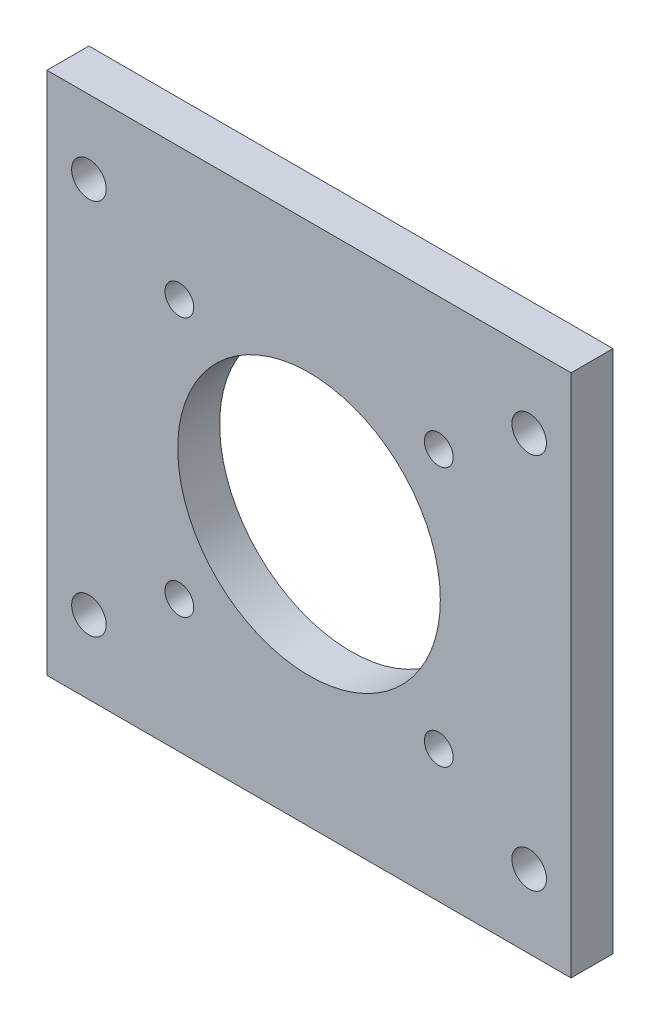
ISO-10303-21;
HEADER;
FILE_DESCRIPTION(('STEP AP214'),'2;1');
FILE_NAME('part.step','',(''),(''),'','','');
FILE_SCHEMA(('AUTOMOTIVE_DESIGN { 1 0 10303 214 1 1 1 1 }'));
ENDSEC;
DATA;
#1=APPLICATION_CONTEXT('core data for automotive mechanical design processes');
#2=APPLICATION_PROTOCOL_DEFINITION('international standard','automotive_design',2000,#1);
#3=PRODUCT_CONTEXT('',#1,'mechanical');
#4=PRODUCT('Part','Part','',(#3));
#5=PRODUCT_RELATED_PRODUCT_CATEGORY('part','',(#4));
#6=PRODUCT_DEFINITION_FORMATION('','',#4);
#7=PRODUCT_DEFINITION_CONTEXT('part definition',#1,'design');
#8=PRODUCT_DEFINITION('design','',#6,#7);
#9=PRODUCT_DEFINITION_SHAPE('','',#8);
#10=(LENGTH_UNIT() NAMED_UNIT(*) SI_UNIT(.MILLI.,.METRE.));
#11=(NAMED_UNIT(*) PLANE_ANGLE_UNIT() SI_UNIT($,.RADIAN.));
#12=(NAMED_UNIT(*) SI_UNIT($,.STERADIAN.) SOLID_ANGLE_UNIT());
#13=UNCERTAINTY_MEASURE_WITH_UNIT(LENGTH_MEASURE(1.E-05),#10,'distance_accuracy_value','');
#14=(GEOMETRIC_REPRESENTATION_CONTEXT(3) GLOBAL_UNCERTAINTY_ASSIGNED_CONTEXT((#13)) GLOBAL_UNIT_ASSIGNED_CONTEXT((#10,
#11,#12)) REPRESENTATION_CONTEXT('',''));
#15=CARTESIAN_POINT('',(0.,0.,0.));
#16=DIRECTION('',(0.,0.,1.));
#17=DIRECTION('',(1.,0.,0.));
#18=AXIS2_PLACEMENT_3D('',#15,#16,#17);
#19=CARTESIAN_POINT('',(0.,0.,8.));
#20=DIRECTION('',(0.,0.,-1.));
#21=DIRECTION('',(-1.,0.,0.));
#22=AXIS2_PLACEMENT_3D('',#19,#20,#21);
#23=PLANE('',#22);
#24=DIRECTION('',(0.,-1.,0.));
#25=VECTOR('',#24,1.);
#26=CARTESIAN_POINT('',(-50.,-50.,8.));
#27=LINE('',#26,#25);
#28=CARTESIAN_POINT('',(-50.,50.,8.));
#29=VERTEX_POINT('',#28);
#30=CARTESIAN_POINT('',(-50.,-50.,8.));
#31=VERTEX_POINT('',#30);
#32=EDGE_CURVE('E91',#29,#31,#27,.T.);
#33=ORIENTED_EDGE('',*,*,#32,.T.);
#34=DIRECTION('',(1.,0.,0.));
#35=VECTOR('',#34,1.);
#36=CARTESIAN_POINT('',(-50.,-50.,8.));
#37=LINE('',#36,#35);
#38=CARTESIAN_POINT('',(50.,-50.,8.));
#39=VERTEX_POINT('',#38);
#40=EDGE_CURVE('E86',#31,#39,#37,.T.);
#41=ORIENTED_EDGE('',*,*,#40,.T.);
#42=DIRECTION('',(0.,1.,0.));
#43=VECTOR('',#42,1.);
#44=CARTESIAN_POINT('',(50.,-50.,8.));
#45=LINE('',#44,#43);
#46=CARTESIAN_POINT('',(50.,50.,8.));
#47=VERTEX_POINT('',#46);
#48=EDGE_CURVE('E87',#39,#47,#45,.T.);
#49=ORIENTED_EDGE('',*,*,#48,.T.);
#50=DIRECTION('',(-1.,0.,0.));
#51=VECTOR('',#50,1.);
#52=CARTESIAN_POINT('',(-50.,50.,8.));
#53=LINE('',#52,#51);
#54=EDGE_CURVE('E57',#47,#29,#53,.T.);
#55=ORIENTED_EDGE('',*,*,#54,.T.);
#56=EDGE_LOOP('',(#33,#41,#49,#55));
#57=FACE_BOUND('',#56,.T.);
#58=CARTESIAN_POINT('',(0.,0.,8.));
#59=DIRECTION('',(0.,0.,1.));
#60=DIRECTION('',(1.,0.,0.));
#61=AXIS2_PLACEMENT_3D('',#58,#59,#60);
#62=CIRCLE('',#61,25.05);
#63=CARTESIAN_POINT('',(25.05,0.,8.));
#64=VERTEX_POINT('',#63);
#65=EDGE_CURVE('E107',#64,#64,#62,.T.);
#66=ORIENTED_EDGE('',*,*,#65,.F.);
#67=EDGE_LOOP('',(#66));
#68=FACE_BOUND('',#67,.T.);
#69=CARTESIAN_POINT('',(-42.,-36.,8.));
#70=DIRECTION('',(0.,0.,1.));
#71=DIRECTION('',(1.,0.,0.));
#72=AXIS2_PLACEMENT_3D('',#69,#70,#71);
#73=CIRCLE('',#72,3.3);
#74=CARTESIAN_POINT('',(-38.7,-36.,8.));
#75=VERTEX_POINT('',#74);
#76=EDGE_CURVE('E123',#75,#75,#73,.T.);
#77=ORIENTED_EDGE('',*,*,#76,.F.);
#78=EDGE_LOOP('',(#77));
#79=FACE_BOUND('',#78,.T.);
#80=CARTESIAN_POINT('',(-42.,36.,8.));
#81=DIRECTION('',(0.,0.,1.));
#82=DIRECTION('',(1.,0.,0.));
#83=AXIS2_PLACEMENT_3D('',#80,#81,#82);
#84=CIRCLE('',#83,3.3);
#85=CARTESIAN_POINT('',(-38.7,36.,8.));
#86=VERTEX_POINT('',#85);
#87=EDGE_CURVE('E130',#86,#86,#84,.T.);
#88=ORIENTED_EDGE('',*,*,#87,.F.);
#89=EDGE_LOOP('',(#88));
#90=FACE_BOUND('',#89,.T.);
#91=CARTESIAN_POINT('',(42.,-36.,8.));
#92=DIRECTION('',(0.,0.,1.));
#93=DIRECTION('',(1.,0.,0.));
#94=AXIS2_PLACEMENT_3D('',#91,#92,#93);
#95=CIRCLE('',#94,3.3);
#96=CARTESIAN_POINT('',(45.3,-36.,8.));
#97=VERTEX_POINT('',#96);
#98=EDGE_CURVE('E133',#97,#97,#95,.T.);
#99=ORIENTED_EDGE('',*,*,#98,.F.);
#100=EDGE_LOOP('',(#99));
#101=FACE_BOUND('',#100,.T.);
#102=CARTESIAN_POINT('',(42.,36.,8.));
#103=DIRECTION('',(0.,0.,1.));
#104=DIRECTION('',(1.,0.,0.));
#105=AXIS2_PLACEMENT_3D('',#102,#103,#104);
#106=CIRCLE('',#105,3.3);
#107=CARTESIAN_POINT('',(45.3,36.,8.));
#108=VERTEX_POINT('',#107);
#109=EDGE_CURVE('E137',#108,#108,#106,.T.);
#110=ORIENTED_EDGE('',*,*,#109,.F.);
#111=EDGE_LOOP('',(#110));
#112=FACE_BOUND('',#111,.T.);
#113=CARTESIAN_POINT('',(-24.7487373415292,-24.7487373415292,8.));
#114=DIRECTION('',(0.,0.,1.));
#115=DIRECTION('',(1.,0.,0.));
#116=AXIS2_PLACEMENT_3D('',#113,#114,#115);
#117=CIRCLE('',#116,2.75);
#118=CARTESIAN_POINT('',(-21.9987373415292,-24.7487373415292,8.));
#119=VERTEX_POINT('',#118);
#120=EDGE_CURVE('E144',#119,#119,#117,.T.);
#121=ORIENTED_EDGE('',*,*,#120,.F.);
#122=EDGE_LOOP('',(#121));
#123=FACE_BOUND('',#122,.T.);
#124=CARTESIAN_POINT('',(-24.7487373415292,24.7487373415292,8.));
#125=DIRECTION('',(0.,0.,1.));
#126=DIRECTION('',(1.,0.,0.));
#127=AXIS2_PLACEMENT_3D('',#124,#125,#126);
#128=CIRCLE('',#127,2.75);
#129=CARTESIAN_POINT('',(-21.9987373415292,24.7487373415292,8.));
#130=VERTEX_POINT('',#129);
#131=EDGE_CURVE('E152',#130,#130,#128,.T.);
#132=ORIENTED_EDGE('',*,*,#131,.F.);
#133=EDGE_LOOP('',(#132));
#134=FACE_BOUND('',#133,.T.);
#135=CARTESIAN_POINT('',(24.7487373415292,-24.7487373415292,8.));
#136=DIRECTION('',(0.,0.,1.));
#137=DIRECTION('',(1.,0.,0.));
#138=AXIS2_PLACEMENT_3D('',#135,#136,#137);
#139=CIRCLE('',#138,2.75);
#140=CARTESIAN_POINT('',(27.4987373415292,-24.7487373415292,8.));
#141=VERTEX_POINT('',#140);
#142=EDGE_CURVE('E160',#141,#141,#139,.T.);
#143=ORIENTED_EDGE('',*,*,#142,.F.);
#144=EDGE_LOOP('',(#143));
#145=FACE_BOUND('',#144,.T.);
#146=CARTESIAN_POINT('',(24.7487373415292,24.7487373415292,8.));
#147=DIRECTION('',(0.,0.,1.));
#148=DIRECTION('',(1.,0.,0.));
#149=AXIS2_PLACEMENT_3D('',#146,#147,#148);
#150=CIRCLE('',#149,2.75);
#151=CARTESIAN_POINT('',(27.4987373415292,24.7487373415292,8.));
#152=VERTEX_POINT('',#151);
#153=EDGE_CURVE('E165',#152,#152,#150,.T.);
#154=ORIENTED_EDGE('',*,*,#153,.F.);
#155=EDGE_LOOP('',(#154));
#156=FACE_BOUND('',#155,.T.);
#157=ADVANCED_FACE('F39',(#57,#68,#79,#90,#101,#112,#123,#134,#145,#156),#23,.F.);
#158=CARTESIAN_POINT('',(0.,0.,0.));
#159=DIRECTION('',(0.,0.,-1.));
#160=DIRECTION('',(-1.,0.,0.));
#161=AXIS2_PLACEMENT_3D('',#158,#159,#160);
#162=PLANE('',#161);
#163=CARTESIAN_POINT('',(24.7487373415292,-24.7487373415292,0.));
#164=DIRECTION('',(0.,0.,1.));
#165=DIRECTION('',(1.,0.,0.));
#166=AXIS2_PLACEMENT_3D('',#163,#164,#165);
#167=CIRCLE('',#166,2.75);
#168=CARTESIAN_POINT('',(27.4987373415292,-24.7487373415292,0.));
#169=VERTEX_POINT('',#168);
#170=EDGE_CURVE('E158',#169,#169,#167,.T.);
#171=ORIENTED_EDGE('',*,*,#170,.T.);
#172=EDGE_LOOP('',(#171));
#173=FACE_BOUND('',#172,.T.);
#174=CARTESIAN_POINT('',(-24.7487373415292,-24.7487373415292,0.));
#175=DIRECTION('',(0.,0.,1.));
#176=DIRECTION('',(1.,0.,0.));
#177=AXIS2_PLACEMENT_3D('',#174,#175,#176);
#178=CIRCLE('',#177,2.75);
#179=CARTESIAN_POINT('',(-21.9987373415292,-24.7487373415292,0.));
#180=VERTEX_POINT('',#179);
#181=EDGE_CURVE('E149',#180,#180,#178,.T.);
#182=ORIENTED_EDGE('',*,*,#181,.T.);
#183=EDGE_LOOP('',(#182));
#184=FACE_BOUND('',#183,.T.);
#185=CARTESIAN_POINT('',(42.,-36.,0.));
#186=DIRECTION('',(0.,0.,1.));
#187=DIRECTION('',(1.,0.,0.));
#188=AXIS2_PLACEMENT_3D('',#185,#186,#187);
#189=CIRCLE('',#188,3.3);
#190=CARTESIAN_POINT('',(45.3,-36.,0.));
#191=VERTEX_POINT('',#190);
#192=EDGE_CURVE('E136',#191,#191,#189,.T.);
#193=ORIENTED_EDGE('',*,*,#192,.T.);
#194=EDGE_LOOP('',(#193));
#195=FACE_BOUND('',#194,.T.);
#196=CARTESIAN_POINT('',(-42.,-36.,0.));
#197=DIRECTION('',(0.,0.,1.));
#198=DIRECTION('',(1.,0.,0.));
#199=AXIS2_PLACEMENT_3D('',#196,#197,#198);
#200=CIRCLE('',#199,3.3);
#201=CARTESIAN_POINT('',(-38.7,-36.,0.));
#202=VERTEX_POINT('',#201);
#203=EDGE_CURVE('E125',#202,#202,#200,.T.);
#204=ORIENTED_EDGE('',*,*,#203,.T.);
#205=EDGE_LOOP('',(#204));
#206=FACE_BOUND('',#205,.T.);
#207=DIRECTION('',(0.,-1.,0.));
#208=VECTOR('',#207,1.);
#209=CARTESIAN_POINT('',(-50.,-50.,0.));
#210=LINE('',#209,#208);
#211=CARTESIAN_POINT('',(-50.,50.,0.));
#212=VERTEX_POINT('',#211);
#213=CARTESIAN_POINT('',(-50.,-50.,0.));
#214=VERTEX_POINT('',#213);
#215=EDGE_CURVE('E104',#212,#214,#210,.T.);
#216=ORIENTED_EDGE('',*,*,#215,.F.);
#217=DIRECTION('',(-1.,0.,0.));
#218=VECTOR('',#217,1.);
#219=CARTESIAN_POINT('',(-50.,50.,0.));
#220=LINE('',#219,#218);
#221=CARTESIAN_POINT('',(50.,50.,0.));
#222=VERTEX_POINT('',#221);
#223=EDGE_CURVE('E80',#222,#212,#220,.T.);
#224=ORIENTED_EDGE('',*,*,#223,.F.);
#225=DIRECTION('',(0.,1.,0.));
#226=VECTOR('',#225,1.);
#227=CARTESIAN_POINT('',(50.,-50.,0.));
#228=LINE('',#227,#226);
#229=CARTESIAN_POINT('',(50.,-50.,0.));
#230=VERTEX_POINT('',#229);
#231=EDGE_CURVE('E75',#230,#222,#228,.T.);
#232=ORIENTED_EDGE('',*,*,#231,.F.);
#233=DIRECTION('',(1.,0.,0.));
#234=VECTOR('',#233,1.);
#235=CARTESIAN_POINT('',(-50.,-50.,0.));
#236=LINE('',#235,#234);
#237=EDGE_CURVE('E94',#214,#230,#236,.T.);
#238=ORIENTED_EDGE('',*,*,#237,.F.);
#239=EDGE_LOOP('',(#216,#224,#232,#238));
#240=FACE_BOUND('',#239,.T.);
#241=CARTESIAN_POINT('',(0.,0.,0.));
#242=DIRECTION('',(0.,0.,1.));
#243=DIRECTION('',(1.,0.,0.));
#244=AXIS2_PLACEMENT_3D('',#241,#242,#243);
#245=CIRCLE('',#244,25.05);
#246=CARTESIAN_POINT('',(25.05,0.,0.));
#247=VERTEX_POINT('',#246);
#248=EDGE_CURVE('E120',#247,#247,#245,.T.);
#249=ORIENTED_EDGE('',*,*,#248,.T.);
#250=EDGE_LOOP('',(#249));
#251=FACE_BOUND('',#250,.T.);
#252=CARTESIAN_POINT('',(-42.,36.,0.));
#253=DIRECTION('',(0.,0.,1.));
#254=DIRECTION('',(1.,0.,0.));
#255=AXIS2_PLACEMENT_3D('',#252,#253,#254);
#256=CIRCLE('',#255,3.3);
#257=CARTESIAN_POINT('',(-38.7,36.,0.));
#258=VERTEX_POINT('',#257);
#259=EDGE_CURVE('E127',#258,#258,#256,.T.);
#260=ORIENTED_EDGE('',*,*,#259,.T.);
#261=EDGE_LOOP('',(#260));
#262=FACE_BOUND('',#261,.T.);
#263=CARTESIAN_POINT('',(42.,36.,0.));
#264=DIRECTION('',(0.,0.,1.));
#265=DIRECTION('',(1.,0.,0.));
#266=AXIS2_PLACEMENT_3D('',#263,#264,#265);
#267=CIRCLE('',#266,3.3);
#268=CARTESIAN_POINT('',(45.3,36.,0.));
#269=VERTEX_POINT('',#268);
#270=EDGE_CURVE('E145',#269,#269,#267,.T.);
#271=ORIENTED_EDGE('',*,*,#270,.T.);
#272=EDGE_LOOP('',(#271));
#273=FACE_BOUND('',#272,.T.);
#274=CARTESIAN_POINT('',(-24.7487373415292,24.7487373415292,0.));
#275=DIRECTION('',(0.,0.,1.));
#276=DIRECTION('',(1.,0.,0.));
#277=AXIS2_PLACEMENT_3D('',#274,#275,#276);
#278=CIRCLE('',#277,2.75);
#279=CARTESIAN_POINT('',(-21.9987373415292,24.7487373415292,0.));
#280=VERTEX_POINT('',#279);
#281=EDGE_CURVE('E151',#280,#280,#278,.T.);
#282=ORIENTED_EDGE('',*,*,#281,.T.);
#283=EDGE_LOOP('',(#282));
#284=FACE_BOUND('',#283,.T.);
#285=CARTESIAN_POINT('',(24.7487373415292,24.7487373415292,0.));
#286=DIRECTION('',(0.,0.,1.));
#287=DIRECTION('',(1.,0.,0.));
#288=AXIS2_PLACEMENT_3D('',#285,#286,#287);
#289=CIRCLE('',#288,2.75);
#290=CARTESIAN_POINT('',(27.4987373415292,24.7487373415292,0.));
#291=VERTEX_POINT('',#290);
#292=EDGE_CURVE('E168',#291,#291,#289,.T.);
#293=ORIENTED_EDGE('',*,*,#292,.T.);
#294=EDGE_LOOP('',(#293));
#295=FACE_BOUND('',#294,.T.);
#296=ADVANCED_FACE('F114',(#173,#184,#195,#206,#240,#251,#262,#273,#284,#295),#162,.T.);
#297=CARTESIAN_POINT('',(-50.,-50.,8.));
#298=DIRECTION('',(1.,0.,0.));
#299=DIRECTION('',(0.,0.,-1.));
#300=AXIS2_PLACEMENT_3D('',#297,#298,#299);
#301=PLANE('',#300);
#302=ORIENTED_EDGE('',*,*,#215,.T.);
#303=DIRECTION('',(0.,0.,-1.));
#304=VECTOR('',#303,1.);
#305=CARTESIAN_POINT('',(-50.,-50.,8.));
#306=LINE('',#305,#304);
#307=EDGE_CURVE('E11',#31,#214,#306,.T.);
#308=ORIENTED_EDGE('',*,*,#307,.F.);
#309=ORIENTED_EDGE('',*,*,#32,.F.);
#310=DIRECTION('',(0.,0.,-1.));
#311=VECTOR('',#310,1.);
#312=CARTESIAN_POINT('',(-50.,50.,8.));
#313=LINE('',#312,#311);
#314=EDGE_CURVE('E98',#29,#212,#313,.T.);
#315=ORIENTED_EDGE('',*,*,#314,.T.);
#316=EDGE_LOOP('',(#302,#308,#309,#315));
#317=FACE_BOUND('',#316,.T.);
#318=ADVANCED_FACE('F41',(#317),#301,.F.);
#319=CARTESIAN_POINT('',(-50.,-50.,8.));
#320=DIRECTION('',(0.,1.,0.));
#321=DIRECTION('',(0.,0.,1.));
#322=AXIS2_PLACEMENT_3D('',#319,#320,#321);
#323=PLANE('',#322);
#324=ORIENTED_EDGE('',*,*,#237,.T.);
#325=DIRECTION('',(0.,0.,-1.));
#326=VECTOR('',#325,1.);
#327=CARTESIAN_POINT('',(50.,-50.,8.));
#328=LINE('',#327,#326);
#329=EDGE_CURVE('E48',#39,#230,#328,.T.);
#330=ORIENTED_EDGE('',*,*,#329,.F.);
#331=ORIENTED_EDGE('',*,*,#40,.F.);
#332=ORIENTED_EDGE('',*,*,#307,.T.);
#333=EDGE_LOOP('',(#324,#330,#331,#332));
#334=FACE_BOUND('',#333,.T.);
#335=ADVANCED_FACE('F92',(#334),#323,.F.);
#336=CARTESIAN_POINT('',(50.,-50.,8.));
#337=DIRECTION('',(-1.,0.,0.));
#338=DIRECTION('',(0.,0.,1.));
#339=AXIS2_PLACEMENT_3D('',#336,#337,#338);
#340=PLANE('',#339);
#341=ORIENTED_EDGE('',*,*,#231,.T.);
#342=DIRECTION('',(0.,0.,-1.));
#343=VECTOR('',#342,1.);
#344=CARTESIAN_POINT('',(50.,50.,8.));
#345=LINE('',#344,#343);
#346=EDGE_CURVE('E96',#47,#222,#345,.T.);
#347=ORIENTED_EDGE('',*,*,#346,.F.);
#348=ORIENTED_EDGE('',*,*,#48,.F.);
#349=ORIENTED_EDGE('',*,*,#329,.T.);
#350=EDGE_LOOP('',(#341,#347,#348,#349));
#351=FACE_BOUND('',#350,.T.);
#352=ADVANCED_FACE('F100',(#351),#340,.F.);
#353=CARTESIAN_POINT('',(-50.,50.,8.));
#354=DIRECTION('',(0.,-1.,0.));
#355=DIRECTION('',(0.,0.,-1.));
#356=AXIS2_PLACEMENT_3D('',#353,#354,#355);
#357=PLANE('',#356);
#358=ORIENTED_EDGE('',*,*,#223,.T.);
#359=ORIENTED_EDGE('',*,*,#314,.F.);
#360=ORIENTED_EDGE('',*,*,#54,.F.);
#361=ORIENTED_EDGE('',*,*,#346,.T.);
#362=EDGE_LOOP('',(#358,#359,#360,#361));
#363=FACE_BOUND('',#362,.T.);
#364=ADVANCED_FACE('F112',(#363),#357,.F.);
#365=CARTESIAN_POINT('',(0.,0.,8.));
#366=DIRECTION('',(0.,0.,-1.));
#367=DIRECTION('',(-1.,0.,0.));
#368=AXIS2_PLACEMENT_3D('',#365,#366,#367);
#369=CYLINDRICAL_SURFACE('',#368,25.05);
#370=ORIENTED_EDGE('',*,*,#65,.T.);
#371=EDGE_LOOP('',(#370));
#372=FACE_BOUND('',#371,.T.);
#373=ORIENTED_EDGE('',*,*,#248,.F.);
#374=EDGE_LOOP('',(#373));
#375=FACE_BOUND('',#374,.T.);
#376=ADVANCED_FACE('F183',(#372,#375),#369,.F.);
#377=CARTESIAN_POINT('',(-42.,-36.,8.));
#378=DIRECTION('',(0.,0.,-1.));
#379=DIRECTION('',(-1.,0.,0.));
#380=AXIS2_PLACEMENT_3D('',#377,#378,#379);
#381=CYLINDRICAL_SURFACE('',#380,3.3);
#382=ORIENTED_EDGE('',*,*,#76,.T.);
#383=EDGE_LOOP('',(#382));
#384=FACE_BOUND('',#383,.T.);
#385=ORIENTED_EDGE('',*,*,#203,.F.);
#386=EDGE_LOOP('',(#385));
#387=FACE_BOUND('',#386,.T.);
#388=ADVANCED_FACE('F228',(#384,#387),#381,.F.);
#389=CARTESIAN_POINT('',(-42.,36.,8.));
#390=DIRECTION('',(0.,0.,-1.));
#391=DIRECTION('',(-1.,0.,0.));
#392=AXIS2_PLACEMENT_3D('',#389,#390,#391);
#393=CYLINDRICAL_SURFACE('',#392,3.3);
#394=ORIENTED_EDGE('',*,*,#87,.T.);
#395=EDGE_LOOP('',(#394));
#396=FACE_BOUND('',#395,.T.);
#397=ORIENTED_EDGE('',*,*,#259,.F.);
#398=EDGE_LOOP('',(#397));
#399=FACE_BOUND('',#398,.T.);
#400=ADVANCED_FACE('F237',(#396,#399),#393,.F.);
#401=CARTESIAN_POINT('',(42.,-36.,8.));
#402=DIRECTION('',(0.,0.,-1.));
#403=DIRECTION('',(-1.,0.,0.));
#404=AXIS2_PLACEMENT_3D('',#401,#402,#403);
#405=CYLINDRICAL_SURFACE('',#404,3.3);
#406=ORIENTED_EDGE('',*,*,#98,.T.);
#407=EDGE_LOOP('',(#406));
#408=FACE_BOUND('',#407,.T.);
#409=ORIENTED_EDGE('',*,*,#192,.F.);
#410=EDGE_LOOP('',(#409));
#411=FACE_BOUND('',#410,.T.);
#412=ADVANCED_FACE('F241',(#408,#411),#405,.F.);
#413=CARTESIAN_POINT('',(42.,36.,8.));
#414=DIRECTION('',(0.,0.,-1.));
#415=DIRECTION('',(-1.,0.,0.));
#416=AXIS2_PLACEMENT_3D('',#413,#414,#415);
#417=CYLINDRICAL_SURFACE('',#416,3.3);
#418=ORIENTED_EDGE('',*,*,#109,.T.);
#419=EDGE_LOOP('',(#418));
#420=FACE_BOUND('',#419,.T.);
#421=ORIENTED_EDGE('',*,*,#270,.F.);
#422=EDGE_LOOP('',(#421));
#423=FACE_BOUND('',#422,.T.);
#424=ADVANCED_FACE('F255',(#420,#423),#417,.F.);
#425=CARTESIAN_POINT('',(-24.7487373415292,-24.7487373415292,8.));
#426=DIRECTION('',(0.,0.,-1.));
#427=DIRECTION('',(-1.,0.,0.));
#428=AXIS2_PLACEMENT_3D('',#425,#426,#427);
#429=CYLINDRICAL_SURFACE('',#428,2.75);
#430=ORIENTED_EDGE('',*,*,#120,.T.);
#431=EDGE_LOOP('',(#430));
#432=FACE_BOUND('',#431,.T.);
#433=ORIENTED_EDGE('',*,*,#181,.F.);
#434=EDGE_LOOP('',(#433));
#435=FACE_BOUND('',#434,.T.);
#436=ADVANCED_FACE('F265',(#432,#435),#429,.F.);
#437=CARTESIAN_POINT('',(-24.7487373415292,24.7487373415292,8.));
#438=DIRECTION('',(0.,0.,-1.));
#439=DIRECTION('',(-1.,0.,0.));
#440=AXIS2_PLACEMENT_3D('',#437,#438,#439);
#441=CYLINDRICAL_SURFACE('',#440,2.75);
#442=ORIENTED_EDGE('',*,*,#131,.T.);
#443=EDGE_LOOP('',(#442));
#444=FACE_BOUND('',#443,.T.);
#445=ORIENTED_EDGE('',*,*,#281,.F.);
#446=EDGE_LOOP('',(#445));
#447=FACE_BOUND('',#446,.T.);
#448=ADVANCED_FACE('F271',(#444,#447),#441,.F.);
#449=CARTESIAN_POINT('',(24.7487373415292,-24.7487373415292,8.));
#450=DIRECTION('',(0.,0.,-1.));
#451=DIRECTION('',(-1.,0.,0.));
#452=AXIS2_PLACEMENT_3D('',#449,#450,#451);
#453=CYLINDRICAL_SURFACE('',#452,2.75);
#454=ORIENTED_EDGE('',*,*,#142,.T.);
#455=EDGE_LOOP('',(#454));
#456=FACE_BOUND('',#455,.T.);
#457=ORIENTED_EDGE('',*,*,#170,.F.);
#458=EDGE_LOOP('',(#457));
#459=FACE_BOUND('',#458,.T.);
#460=ADVANCED_FACE('F279',(#456,#459),#453,.F.);
#461=CARTESIAN_POINT('',(24.7487373415292,24.7487373415292,8.));
#462=DIRECTION('',(0.,0.,-1.));
#463=DIRECTION('',(-1.,0.,0.));
#464=AXIS2_PLACEMENT_3D('',#461,#462,#463);
#465=CYLINDRICAL_SURFACE('',#464,2.75);
#466=ORIENTED_EDGE('',*,*,#153,.T.);
#467=EDGE_LOOP('',(#466));
#468=FACE_BOUND('',#467,.T.);
#469=ORIENTED_EDGE('',*,*,#292,.F.);
#470=EDGE_LOOP('',(#469));
#471=FACE_BOUND('',#470,.T.);
#472=ADVANCED_FACE('F175',(#468,#471),#465,.F.);
#473=CLOSED_SHELL('',(#157,#296,#318,#335,#352,#364,#376,#388,#400,#412,#424,#436,#448,#460,#472));
#474=MANIFOLD_SOLID_BREP('B2',#473);
#475=ADVANCED_BREP_SHAPE_REPRESENTATION('',(#18,#474),#14);
#476=SHAPE_DEFINITION_REPRESENTATION(#9,#475);
ENDSEC;
END-ISO-10303-21;
